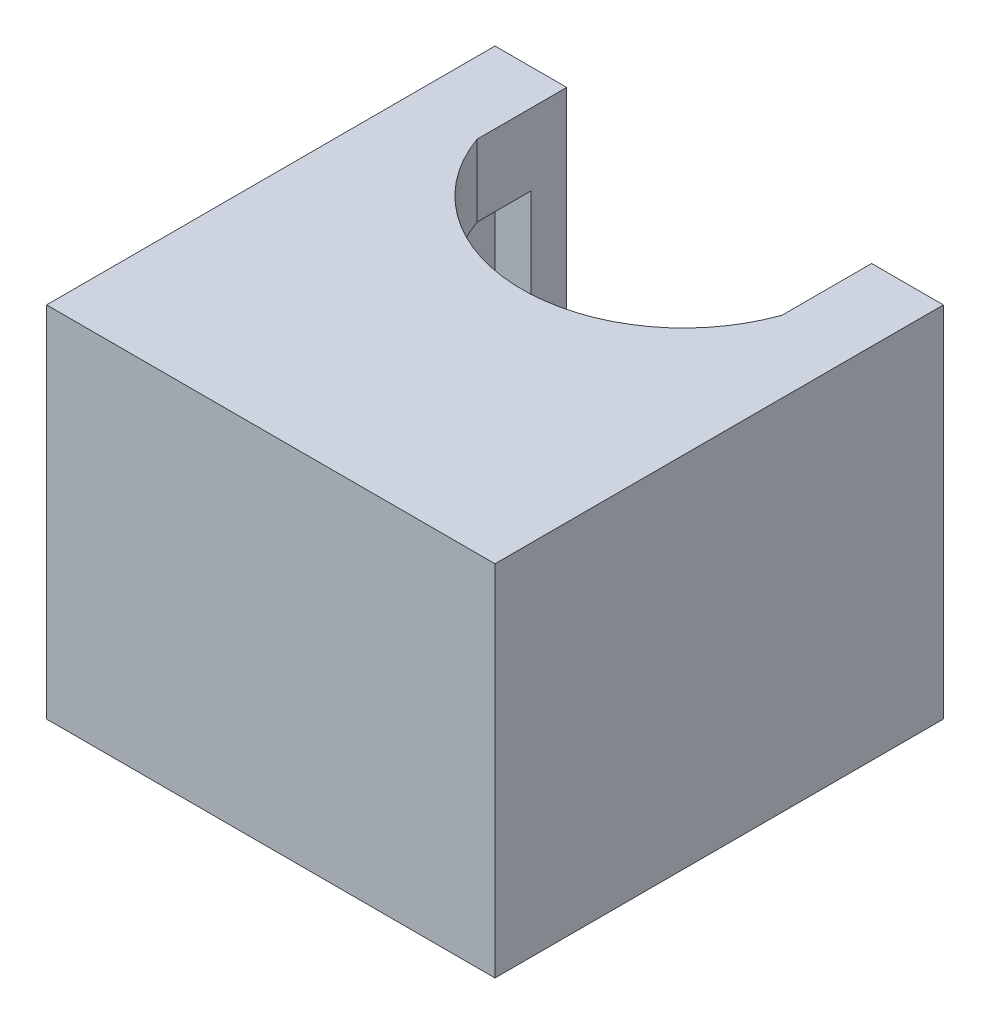
ISO-10303-21;
HEADER;
FILE_DESCRIPTION(('STEP AP214'),'2;1');
FILE_NAME('part.step','',(''),(''),'','','');
FILE_SCHEMA(('AUTOMOTIVE_DESIGN { 1 0 10303 214 1 1 1 1 }'));
ENDSEC;
DATA;
#1=APPLICATION_CONTEXT('core data for automotive mechanical design processes');
#2=APPLICATION_PROTOCOL_DEFINITION('international standard','automotive_design',2000,#1);
#3=PRODUCT_CONTEXT('',#1,'mechanical');
#4=PRODUCT('Part','Part','',(#3));
#5=PRODUCT_RELATED_PRODUCT_CATEGORY('part','',(#4));
#6=PRODUCT_DEFINITION_FORMATION('','',#4);
#7=PRODUCT_DEFINITION_CONTEXT('part definition',#1,'design');
#8=PRODUCT_DEFINITION('design','',#6,#7);
#9=PRODUCT_DEFINITION_SHAPE('','',#8);
#10=(LENGTH_UNIT() NAMED_UNIT(*) SI_UNIT(.MILLI.,.METRE.));
#11=(NAMED_UNIT(*) PLANE_ANGLE_UNIT() SI_UNIT($,.RADIAN.));
#12=(NAMED_UNIT(*) SI_UNIT($,.STERADIAN.) SOLID_ANGLE_UNIT());
#13=UNCERTAINTY_MEASURE_WITH_UNIT(LENGTH_MEASURE(1.E-05),#10,'distance_accuracy_value','');
#14=(GEOMETRIC_REPRESENTATION_CONTEXT(3) GLOBAL_UNCERTAINTY_ASSIGNED_CONTEXT((#13)) GLOBAL_UNIT_ASSIGNED_CONTEXT((#10,
#11,#12)) REPRESENTATION_CONTEXT('',''));
#15=CARTESIAN_POINT('',(0.,0.,0.));
#16=DIRECTION('',(0.,0.,1.));
#17=DIRECTION('',(1.,0.,0.));
#18=AXIS2_PLACEMENT_3D('',#15,#16,#17);
#19=CARTESIAN_POINT('',(-12.5,10.,25.));
#20=DIRECTION('',(0.,-1.,0.));
#21=DIRECTION('',(0.,0.,-1.));
#22=AXIS2_PLACEMENT_3D('',#19,#20,#21);
#23=PLANE('',#22);
#24=DIRECTION('',(0.,0.,1.));
#25=VECTOR('',#24,1.);
#26=CARTESIAN_POINT('',(8.5,10.,0.));
#27=LINE('',#26,#25);
#28=CARTESIAN_POINT('',(8.5,10.,0.));
#29=VERTEX_POINT('',#28);
#30=CARTESIAN_POINT('',(8.5,10.,5.));
#31=VERTEX_POINT('',#30);
#32=EDGE_CURVE('E168',#29,#31,#27,.T.);
#33=ORIENTED_EDGE('',*,*,#32,.T.);
#34=CARTESIAN_POINT('',(0.,10.,1.97916666666667));
#35=DIRECTION('',(0.,1.,0.));
#36=DIRECTION('',(0.,0.,1.));
#37=AXIS2_PLACEMENT_3D('',#34,#35,#36);
#38=CIRCLE('',#37,9.02083333333333);
#39=CARTESIAN_POINT('',(-8.5,10.,5.));
#40=VERTEX_POINT('',#39);
#41=EDGE_CURVE('E186',#40,#31,#38,.T.);
#42=ORIENTED_EDGE('',*,*,#41,.F.);
#43=DIRECTION('',(0.,0.,1.));
#44=VECTOR('',#43,1.);
#45=CARTESIAN_POINT('',(-8.5,10.,0.));
#46=LINE('',#45,#44);
#47=CARTESIAN_POINT('',(-8.5,10.,0.));
#48=VERTEX_POINT('',#47);
#49=EDGE_CURVE('E176',#48,#40,#46,.T.);
#50=ORIENTED_EDGE('',*,*,#49,.F.);
#51=DIRECTION('',(-1.,0.,0.));
#52=VECTOR('',#51,1.);
#53=CARTESIAN_POINT('',(-12.5,10.,0.));
#54=LINE('',#53,#52);
#55=CARTESIAN_POINT('',(-12.5,10.,0.));
#56=VERTEX_POINT('',#55);
#57=EDGE_CURVE('E192',#48,#56,#54,.T.);
#58=ORIENTED_EDGE('',*,*,#57,.T.);
#59=DIRECTION('',(0.,0.,-1.));
#60=VECTOR('',#59,1.);
#61=CARTESIAN_POINT('',(-12.5,10.,25.));
#62=LINE('',#61,#60);
#63=CARTESIAN_POINT('',(-12.5,10.,25.));
#64=VERTEX_POINT('',#63);
#65=EDGE_CURVE('E210',#64,#56,#62,.T.);
#66=ORIENTED_EDGE('',*,*,#65,.F.);
#67=DIRECTION('',(-1.,0.,0.));
#68=VECTOR('',#67,1.);
#69=CARTESIAN_POINT('',(-12.5,10.,25.));
#70=LINE('',#69,#68);
#71=CARTESIAN_POINT('',(12.5,10.,25.));
#72=VERTEX_POINT('',#71);
#73=EDGE_CURVE('E267',#72,#64,#70,.T.);
#74=ORIENTED_EDGE('',*,*,#73,.F.);
#75=DIRECTION('',(0.,0.,-1.));
#76=VECTOR('',#75,1.);
#77=CARTESIAN_POINT('',(12.5,10.,25.));
#78=LINE('',#77,#76);
#79=CARTESIAN_POINT('',(12.5,10.,0.));
#80=VERTEX_POINT('',#79);
#81=EDGE_CURVE('E189',#72,#80,#78,.T.);
#82=ORIENTED_EDGE('',*,*,#81,.T.);
#83=EDGE_CURVE('E182',#80,#29,#54,.T.);
#84=ORIENTED_EDGE('',*,*,#83,.T.);
#85=EDGE_LOOP('',(#33,#42,#50,#58,#66,#74,#82,#84));
#86=FACE_BOUND('',#85,.T.);
#87=ADVANCED_FACE('F67',(#86),#23,.F.);
#88=CARTESIAN_POINT('',(-12.5,-10.,25.));
#89=DIRECTION('',(0.,1.,0.));
#90=DIRECTION('',(0.,0.,1.));
#91=AXIS2_PLACEMENT_3D('',#88,#89,#90);
#92=PLANE('',#91);
#93=DIRECTION('',(0.,0.,1.));
#94=VECTOR('',#93,1.);
#95=CARTESIAN_POINT('',(8.5,-10.,25.));
#96=LINE('',#95,#94);
#97=CARTESIAN_POINT('',(8.5,-10.,0.));
#98=VERTEX_POINT('',#97);
#99=CARTESIAN_POINT('',(8.5,-10.,2.));
#100=VERTEX_POINT('',#99);
#101=EDGE_CURVE('E251',#98,#100,#96,.T.);
#102=ORIENTED_EDGE('',*,*,#101,.F.);
#103=DIRECTION('',(1.,0.,0.));
#104=VECTOR('',#103,1.);
#105=CARTESIAN_POINT('',(-12.5,-10.,0.));
#106=LINE('',#105,#104);
#107=CARTESIAN_POINT('',(12.5,-10.,0.));
#108=VERTEX_POINT('',#107);
#109=EDGE_CURVE('E184',#98,#108,#106,.T.);
#110=ORIENTED_EDGE('',*,*,#109,.T.);
#111=DIRECTION('',(0.,0.,-1.));
#112=VECTOR('',#111,1.);
#113=CARTESIAN_POINT('',(12.5,-10.,25.));
#114=LINE('',#113,#112);
#115=CARTESIAN_POINT('',(12.5,-10.,25.));
#116=VERTEX_POINT('',#115);
#117=EDGE_CURVE('E203',#116,#108,#114,.T.);
#118=ORIENTED_EDGE('',*,*,#117,.F.);
#119=DIRECTION('',(1.,0.,0.));
#120=VECTOR('',#119,1.);
#121=CARTESIAN_POINT('',(-12.5,-10.,25.));
#122=LINE('',#121,#120);
#123=CARTESIAN_POINT('',(-12.5,-10.,25.));
#124=VERTEX_POINT('',#123);
#125=EDGE_CURVE('E207',#124,#116,#122,.T.);
#126=ORIENTED_EDGE('',*,*,#125,.F.);
#127=DIRECTION('',(0.,0.,-1.));
#128=VECTOR('',#127,1.);
#129=CARTESIAN_POINT('',(-12.5,-10.,25.));
#130=LINE('',#129,#128);
#131=CARTESIAN_POINT('',(-12.5,-10.,0.));
#132=VERTEX_POINT('',#131);
#133=EDGE_CURVE('E206',#124,#132,#130,.T.);
#134=ORIENTED_EDGE('',*,*,#133,.T.);
#135=CARTESIAN_POINT('',(-8.5,-10.,0.));
#136=VERTEX_POINT('',#135);
#137=EDGE_CURVE('E199',#132,#136,#106,.T.);
#138=ORIENTED_EDGE('',*,*,#137,.T.);
#139=DIRECTION('',(0.,0.,1.));
#140=VECTOR('',#139,1.);
#141=CARTESIAN_POINT('',(-8.5,-10.,25.));
#142=LINE('',#141,#140);
#143=CARTESIAN_POINT('',(-8.5,-10.,2.));
#144=VERTEX_POINT('',#143);
#145=EDGE_CURVE('E234',#136,#144,#142,.T.);
#146=ORIENTED_EDGE('',*,*,#145,.T.);
#147=DIRECTION('',(1.,0.,0.));
#148=VECTOR('',#147,1.);
#149=CARTESIAN_POINT('',(-10.5,-10.,2.));
#150=LINE('',#149,#148);
#151=CARTESIAN_POINT('',(-10.5,-10.,2.));
#152=VERTEX_POINT('',#151);
#153=EDGE_CURVE('E233',#152,#144,#150,.T.);
#154=ORIENTED_EDGE('',*,*,#153,.F.);
#155=DIRECTION('',(0.,0.,-1.));
#156=VECTOR('',#155,1.);
#157=CARTESIAN_POINT('',(-10.5,-10.,23.));
#158=LINE('',#157,#156);
#159=CARTESIAN_POINT('',(-10.5,-10.,23.));
#160=VERTEX_POINT('',#159);
#161=EDGE_CURVE('E254',#160,#152,#158,.T.);
#162=ORIENTED_EDGE('',*,*,#161,.F.);
#163=DIRECTION('',(-1.,0.,0.));
#164=VECTOR('',#163,1.);
#165=CARTESIAN_POINT('',(-10.5,-10.,23.));
#166=LINE('',#165,#164);
#167=CARTESIAN_POINT('',(10.5,-10.,23.));
#168=VERTEX_POINT('',#167);
#169=EDGE_CURVE('E250',#168,#160,#166,.T.);
#170=ORIENTED_EDGE('',*,*,#169,.F.);
#171=DIRECTION('',(0.,0.,1.));
#172=VECTOR('',#171,1.);
#173=CARTESIAN_POINT('',(10.5,-10.,23.));
#174=LINE('',#173,#172);
#175=CARTESIAN_POINT('',(10.5,-10.,2.));
#176=VERTEX_POINT('',#175);
#177=EDGE_CURVE('E90',#176,#168,#174,.T.);
#178=ORIENTED_EDGE('',*,*,#177,.F.);
#179=EDGE_CURVE('E257',#100,#176,#150,.T.);
#180=ORIENTED_EDGE('',*,*,#179,.F.);
#181=EDGE_LOOP('',(#102,#110,#118,#126,#134,#138,#146,#154,#162,#170,#178,#180));
#182=FACE_BOUND('',#181,.T.);
#183=ADVANCED_FACE('F278',(#182),#92,.F.);
#184=CARTESIAN_POINT('',(0.,0.,0.));
#185=DIRECTION('',(0.,0.,1.));
#186=DIRECTION('',(1.,0.,0.));
#187=AXIS2_PLACEMENT_3D('',#184,#185,#186);
#188=PLANE('',#187);
#189=DIRECTION('',(0.,1.,0.));
#190=VECTOR('',#189,1.);
#191=CARTESIAN_POINT('',(8.5,-16.,0.));
#192=LINE('',#191,#190);
#193=EDGE_CURVE('E171',#98,#29,#192,.T.);
#194=ORIENTED_EDGE('',*,*,#193,.T.);
#195=ORIENTED_EDGE('',*,*,#83,.F.);
#196=DIRECTION('',(0.,1.,0.));
#197=VECTOR('',#196,1.);
#198=CARTESIAN_POINT('',(12.5,10.,0.));
#199=LINE('',#198,#197);
#200=EDGE_CURVE('E195',#108,#80,#199,.T.);
#201=ORIENTED_EDGE('',*,*,#200,.F.);
#202=ORIENTED_EDGE('',*,*,#109,.F.);
#203=EDGE_LOOP('',(#194,#195,#201,#202));
#204=FACE_BOUND('',#203,.T.);
#205=ADVANCED_FACE('F180',(#204),#188,.F.);
#206=CARTESIAN_POINT('',(-10.5,6.,2.));
#207=DIRECTION('',(0.,0.,-1.));
#208=DIRECTION('',(-1.,0.,0.));
#209=AXIS2_PLACEMENT_3D('',#206,#207,#208);
#210=PLANE('',#209);
#211=DIRECTION('',(0.,1.,0.));
#212=VECTOR('',#211,1.);
#213=CARTESIAN_POINT('',(8.5,6.,2.));
#214=LINE('',#213,#212);
#215=CARTESIAN_POINT('',(8.5,6.,2.));
#216=VERTEX_POINT('',#215);
#217=EDGE_CURVE('E328',#100,#216,#214,.T.);
#218=ORIENTED_EDGE('',*,*,#217,.F.);
#219=ORIENTED_EDGE('',*,*,#179,.T.);
#220=DIRECTION('',(0.,-1.,0.));
#221=VECTOR('',#220,1.);
#222=CARTESIAN_POINT('',(10.5,6.,2.));
#223=LINE('',#222,#221);
#224=CARTESIAN_POINT('',(10.5,6.,2.));
#225=VERTEX_POINT('',#224);
#226=EDGE_CURVE('E260',#225,#176,#223,.T.);
#227=ORIENTED_EDGE('',*,*,#226,.F.);
#228=DIRECTION('',(1.,0.,0.));
#229=VECTOR('',#228,1.);
#230=CARTESIAN_POINT('',(-10.5,6.,2.));
#231=LINE('',#230,#229);
#232=EDGE_CURVE('E242',#216,#225,#231,.T.);
#233=ORIENTED_EDGE('',*,*,#232,.F.);
#234=EDGE_LOOP('',(#218,#219,#227,#233));
#235=FACE_BOUND('',#234,.T.);
#236=ADVANCED_FACE('F288',(#235),#210,.F.);
#237=CARTESIAN_POINT('',(0.,6.,0.));
#238=DIRECTION('',(0.,-1.,0.));
#239=DIRECTION('',(0.,0.,-1.));
#240=AXIS2_PLACEMENT_3D('',#237,#238,#239);
#241=PLANE('',#240);
#242=CARTESIAN_POINT('',(0.,6.,1.97916666666667));
#243=DIRECTION('',(0.,-1.,0.));
#244=DIRECTION('',(0.,0.,-1.));
#245=AXIS2_PLACEMENT_3D('',#242,#243,#244);
#246=CIRCLE('',#245,9.02083333333333);
#247=CARTESIAN_POINT('',(8.5,6.,5.));
#248=VERTEX_POINT('',#247);
#249=CARTESIAN_POINT('',(-8.5,6.,5.));
#250=VERTEX_POINT('',#249);
#251=EDGE_CURVE('E214',#248,#250,#246,.T.);
#252=ORIENTED_EDGE('',*,*,#251,.F.);
#253=DIRECTION('',(0.,0.,-1.));
#254=VECTOR('',#253,1.);
#255=CARTESIAN_POINT('',(8.5,6.,0.));
#256=LINE('',#255,#254);
#257=EDGE_CURVE('E12',#248,#216,#256,.T.);
#258=ORIENTED_EDGE('',*,*,#257,.T.);
#259=ORIENTED_EDGE('',*,*,#232,.T.);
#260=DIRECTION('',(0.,0.,1.));
#261=VECTOR('',#260,1.);
#262=CARTESIAN_POINT('',(10.5,6.,23.));
#263=LINE('',#262,#261);
#264=CARTESIAN_POINT('',(10.5,6.,23.));
#265=VERTEX_POINT('',#264);
#266=EDGE_CURVE('E259',#225,#265,#263,.T.);
#267=ORIENTED_EDGE('',*,*,#266,.T.);
#268=DIRECTION('',(-1.,0.,0.));
#269=VECTOR('',#268,1.);
#270=CARTESIAN_POINT('',(-10.5,6.,23.));
#271=LINE('',#270,#269);
#272=CARTESIAN_POINT('',(-10.5,6.,23.));
#273=VERTEX_POINT('',#272);
#274=EDGE_CURVE('E332',#265,#273,#271,.T.);
#275=ORIENTED_EDGE('',*,*,#274,.T.);
#276=DIRECTION('',(0.,0.,-1.));
#277=VECTOR('',#276,1.);
#278=CARTESIAN_POINT('',(-10.5,6.,23.));
#279=LINE('',#278,#277);
#280=CARTESIAN_POINT('',(-10.5,6.,2.));
#281=VERTEX_POINT('',#280);
#282=EDGE_CURVE('E240',#273,#281,#279,.T.);
#283=ORIENTED_EDGE('',*,*,#282,.T.);
#284=CARTESIAN_POINT('',(-8.5,6.,2.));
#285=VERTEX_POINT('',#284);
#286=EDGE_CURVE('E231',#281,#285,#231,.T.);
#287=ORIENTED_EDGE('',*,*,#286,.T.);
#288=DIRECTION('',(0.,0.,-1.));
#289=VECTOR('',#288,1.);
#290=CARTESIAN_POINT('',(-8.5,6.,0.));
#291=LINE('',#290,#289);
#292=EDGE_CURVE('E75',#250,#285,#291,.T.);
#293=ORIENTED_EDGE('',*,*,#292,.F.);
#294=EDGE_LOOP('',(#252,#258,#259,#267,#275,#283,#287,#293));
#295=FACE_BOUND('',#294,.T.);
#296=ADVANCED_FACE('F237',(#295),#241,.T.);
#297=CARTESIAN_POINT('',(12.5,10.,25.));
#298=DIRECTION('',(-1.,0.,0.));
#299=DIRECTION('',(0.,-1.,0.));
#300=AXIS2_PLACEMENT_3D('',#297,#298,#299);
#301=PLANE('',#300);
#302=ORIENTED_EDGE('',*,*,#200,.T.);
#303=ORIENTED_EDGE('',*,*,#81,.F.);
#304=DIRECTION('',(0.,1.,0.));
#305=VECTOR('',#304,1.);
#306=CARTESIAN_POINT('',(12.5,10.,25.));
#307=LINE('',#306,#305);
#308=EDGE_CURVE('E202',#116,#72,#307,.T.);
#309=ORIENTED_EDGE('',*,*,#308,.F.);
#310=ORIENTED_EDGE('',*,*,#117,.T.);
#311=EDGE_LOOP('',(#302,#303,#309,#310));
#312=FACE_BOUND('',#311,.T.);
#313=ADVANCED_FACE('F69',(#312),#301,.F.);
#314=CARTESIAN_POINT('',(-12.5,10.,25.));
#315=DIRECTION('',(1.,0.,0.));
#316=DIRECTION('',(0.,1.,0.));
#317=AXIS2_PLACEMENT_3D('',#314,#315,#316);
#318=PLANE('',#317);
#319=DIRECTION('',(0.,-1.,0.));
#320=VECTOR('',#319,1.);
#321=CARTESIAN_POINT('',(-12.5,10.,0.));
#322=LINE('',#321,#320);
#323=EDGE_CURVE('E191',#56,#132,#322,.T.);
#324=ORIENTED_EDGE('',*,*,#323,.T.);
#325=ORIENTED_EDGE('',*,*,#133,.F.);
#326=DIRECTION('',(0.,-1.,0.));
#327=VECTOR('',#326,1.);
#328=CARTESIAN_POINT('',(-12.5,10.,25.));
#329=LINE('',#328,#327);
#330=EDGE_CURVE('E269',#64,#124,#329,.T.);
#331=ORIENTED_EDGE('',*,*,#330,.F.);
#332=ORIENTED_EDGE('',*,*,#65,.T.);
#333=EDGE_LOOP('',(#324,#325,#331,#332));
#334=FACE_BOUND('',#333,.T.);
#335=ADVANCED_FACE('F281',(#334),#318,.F.);
#336=CARTESIAN_POINT('',(0.,0.,25.));
#337=DIRECTION('',(0.,0.,1.));
#338=DIRECTION('',(1.,0.,0.));
#339=AXIS2_PLACEMENT_3D('',#336,#337,#338);
#340=PLANE('',#339);
#341=ORIENTED_EDGE('',*,*,#308,.T.);
#342=ORIENTED_EDGE('',*,*,#73,.T.);
#343=ORIENTED_EDGE('',*,*,#330,.T.);
#344=ORIENTED_EDGE('',*,*,#125,.T.);
#345=EDGE_LOOP('',(#341,#342,#343,#344));
#346=FACE_BOUND('',#345,.T.);
#347=ADVANCED_FACE('F273',(#346),#340,.T.);
#348=ORIENTED_EDGE('',*,*,#57,.F.);
#349=DIRECTION('',(0.,1.,0.));
#350=VECTOR('',#349,1.);
#351=CARTESIAN_POINT('',(-8.5,-16.,0.));
#352=LINE('',#351,#350);
#353=EDGE_CURVE('E185',#136,#48,#352,.T.);
#354=ORIENTED_EDGE('',*,*,#353,.F.);
#355=ORIENTED_EDGE('',*,*,#137,.F.);
#356=ORIENTED_EDGE('',*,*,#323,.F.);
#357=EDGE_LOOP('',(#348,#354,#355,#356));
#358=FACE_BOUND('',#357,.T.);
#359=ADVANCED_FACE('F296',(#358),#188,.F.);
#360=CARTESIAN_POINT('',(10.5,6.,23.));
#361=DIRECTION('',(1.,0.,0.));
#362=DIRECTION('',(0.,0.,-1.));
#363=AXIS2_PLACEMENT_3D('',#360,#361,#362);
#364=PLANE('',#363);
#365=ORIENTED_EDGE('',*,*,#177,.T.);
#366=DIRECTION('',(0.,-1.,0.));
#367=VECTOR('',#366,1.);
#368=CARTESIAN_POINT('',(10.5,6.,23.));
#369=LINE('',#368,#367);
#370=EDGE_CURVE('E241',#265,#168,#369,.T.);
#371=ORIENTED_EDGE('',*,*,#370,.F.);
#372=ORIENTED_EDGE('',*,*,#266,.F.);
#373=ORIENTED_EDGE('',*,*,#226,.T.);
#374=EDGE_LOOP('',(#365,#371,#372,#373));
#375=FACE_BOUND('',#374,.T.);
#376=ADVANCED_FACE('F299',(#375),#364,.F.);
#377=ORIENTED_EDGE('',*,*,#153,.T.);
#378=DIRECTION('',(0.,1.,0.));
#379=VECTOR('',#378,1.);
#380=CARTESIAN_POINT('',(-8.5,6.,2.));
#381=LINE('',#380,#379);
#382=EDGE_CURVE('E220',#144,#285,#381,.T.);
#383=ORIENTED_EDGE('',*,*,#382,.T.);
#384=ORIENTED_EDGE('',*,*,#286,.F.);
#385=DIRECTION('',(0.,-1.,0.));
#386=VECTOR('',#385,1.);
#387=CARTESIAN_POINT('',(-10.5,6.,2.));
#388=LINE('',#387,#386);
#389=EDGE_CURVE('E262',#281,#152,#388,.T.);
#390=ORIENTED_EDGE('',*,*,#389,.T.);
#391=EDGE_LOOP('',(#377,#383,#384,#390));
#392=FACE_BOUND('',#391,.T.);
#393=ADVANCED_FACE('F230',(#392),#210,.F.);
#394=CARTESIAN_POINT('',(-10.5,6.,23.));
#395=DIRECTION('',(-1.,0.,0.));
#396=DIRECTION('',(0.,0.,1.));
#397=AXIS2_PLACEMENT_3D('',#394,#395,#396);
#398=PLANE('',#397);
#399=ORIENTED_EDGE('',*,*,#161,.T.);
#400=ORIENTED_EDGE('',*,*,#389,.F.);
#401=ORIENTED_EDGE('',*,*,#282,.F.);
#402=DIRECTION('',(0.,-1.,0.));
#403=VECTOR('',#402,1.);
#404=CARTESIAN_POINT('',(-10.5,6.,23.));
#405=LINE('',#404,#403);
#406=EDGE_CURVE('E244',#273,#160,#405,.T.);
#407=ORIENTED_EDGE('',*,*,#406,.T.);
#408=EDGE_LOOP('',(#399,#400,#401,#407));
#409=FACE_BOUND('',#408,.T.);
#410=ADVANCED_FACE('F308',(#409),#398,.F.);
#411=CARTESIAN_POINT('',(-10.5,6.,23.));
#412=DIRECTION('',(0.,0.,1.));
#413=DIRECTION('',(1.,0.,0.));
#414=AXIS2_PLACEMENT_3D('',#411,#412,#413);
#415=PLANE('',#414);
#416=ORIENTED_EDGE('',*,*,#169,.T.);
#417=ORIENTED_EDGE('',*,*,#406,.F.);
#418=ORIENTED_EDGE('',*,*,#274,.F.);
#419=ORIENTED_EDGE('',*,*,#370,.T.);
#420=EDGE_LOOP('',(#416,#417,#418,#419));
#421=FACE_BOUND('',#420,.T.);
#422=ADVANCED_FACE('F305',(#421),#415,.F.);
#423=CARTESIAN_POINT('',(8.5,-16.,0.));
#424=DIRECTION('',(-1.,0.,0.));
#425=DIRECTION('',(0.,0.,1.));
#426=AXIS2_PLACEMENT_3D('',#423,#424,#425);
#427=PLANE('',#426);
#428=ORIENTED_EDGE('',*,*,#101,.T.);
#429=ORIENTED_EDGE('',*,*,#217,.T.);
#430=ORIENTED_EDGE('',*,*,#257,.F.);
#431=DIRECTION('',(0.,1.,0.));
#432=VECTOR('',#431,1.);
#433=CARTESIAN_POINT('',(8.5,-16.,5.));
#434=LINE('',#433,#432);
#435=EDGE_CURVE('E82',#248,#31,#434,.T.);
#436=ORIENTED_EDGE('',*,*,#435,.T.);
#437=ORIENTED_EDGE('',*,*,#32,.F.);
#438=ORIENTED_EDGE('',*,*,#193,.F.);
#439=EDGE_LOOP('',(#428,#429,#430,#436,#437,#438));
#440=FACE_BOUND('',#439,.T.);
#441=ADVANCED_FACE('F170',(#440),#427,.T.);
#442=CARTESIAN_POINT('',(-8.5,-16.,0.));
#443=DIRECTION('',(-1.,0.,0.));
#444=DIRECTION('',(0.,0.,1.));
#445=AXIS2_PLACEMENT_3D('',#442,#443,#444);
#446=PLANE('',#445);
#447=ORIENTED_EDGE('',*,*,#353,.T.);
#448=ORIENTED_EDGE('',*,*,#49,.T.);
#449=DIRECTION('',(0.,1.,0.));
#450=VECTOR('',#449,1.);
#451=CARTESIAN_POINT('',(-8.5,-16.,5.));
#452=LINE('',#451,#450);
#453=EDGE_CURVE('E223',#250,#40,#452,.T.);
#454=ORIENTED_EDGE('',*,*,#453,.F.);
#455=ORIENTED_EDGE('',*,*,#292,.T.);
#456=ORIENTED_EDGE('',*,*,#382,.F.);
#457=ORIENTED_EDGE('',*,*,#145,.F.);
#458=EDGE_LOOP('',(#447,#448,#454,#455,#456,#457));
#459=FACE_BOUND('',#458,.T.);
#460=ADVANCED_FACE('F219',(#459),#446,.F.);
#461=CARTESIAN_POINT('',(0.,-16.,1.97916666666667));
#462=DIRECTION('',(0.,1.,0.));
#463=DIRECTION('',(0.,0.,1.));
#464=AXIS2_PLACEMENT_3D('',#461,#462,#463);
#465=CYLINDRICAL_SURFACE('',#464,9.02083333333333);
#466=ORIENTED_EDGE('',*,*,#251,.T.);
#467=ORIENTED_EDGE('',*,*,#453,.T.);
#468=ORIENTED_EDGE('',*,*,#41,.T.);
#469=ORIENTED_EDGE('',*,*,#435,.F.);
#470=EDGE_LOOP('',(#466,#467,#468,#469));
#471=FACE_BOUND('',#470,.T.);
#472=ADVANCED_FACE('F319',(#471),#465,.F.);
#473=CLOSED_SHELL('',(#87,#183,#205,#236,#296,#313,#335,#347,#359,#376,#393,#410,#422,#441,#460,#472));
#474=MANIFOLD_SOLID_BREP('B2',#473);
#475=ADVANCED_BREP_SHAPE_REPRESENTATION('',(#18,#474),#14);
#476=SHAPE_DEFINITION_REPRESENTATION(#9,#475);
ENDSEC;
END-ISO-10303-21;
